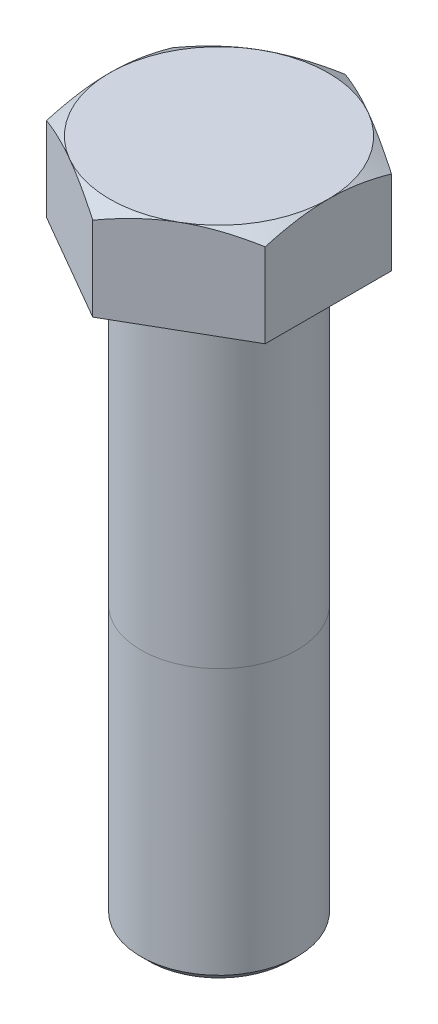
ISO-10303-21;
HEADER;
FILE_DESCRIPTION(('STEP AP214'),'2;1');
FILE_NAME('part.step','',(''),(''),'','','');
FILE_SCHEMA(('AUTOMOTIVE_DESIGN { 1 0 10303 214 1 1 1 1 }'));
ENDSEC;
DATA;
#1=APPLICATION_CONTEXT('core data for automotive mechanical design processes');
#2=APPLICATION_PROTOCOL_DEFINITION('international standard','automotive_design',2000,#1);
#3=PRODUCT_CONTEXT('',#1,'mechanical');
#4=PRODUCT('Part','Part','',(#3));
#5=PRODUCT_RELATED_PRODUCT_CATEGORY('part','',(#4));
#6=PRODUCT_DEFINITION_FORMATION('','',#4);
#7=PRODUCT_DEFINITION_CONTEXT('part definition',#1,'design');
#8=PRODUCT_DEFINITION('design','',#6,#7);
#9=PRODUCT_DEFINITION_SHAPE('','',#8);
#10=(LENGTH_UNIT() NAMED_UNIT(*) SI_UNIT(.MILLI.,.METRE.));
#11=(NAMED_UNIT(*) PLANE_ANGLE_UNIT() SI_UNIT($,.RADIAN.));
#12=(NAMED_UNIT(*) SI_UNIT($,.STERADIAN.) SOLID_ANGLE_UNIT());
#13=UNCERTAINTY_MEASURE_WITH_UNIT(LENGTH_MEASURE(1.E-05),#10,'distance_accuracy_value','');
#14=(GEOMETRIC_REPRESENTATION_CONTEXT(3) GLOBAL_UNCERTAINTY_ASSIGNED_CONTEXT((#13)) GLOBAL_UNIT_ASSIGNED_CONTEXT((#10,
#11,#12)) REPRESENTATION_CONTEXT('',''));
#15=CARTESIAN_POINT('',(0.,0.,0.));
#16=DIRECTION('',(0.,0.,1.));
#17=DIRECTION('',(1.,0.,0.));
#18=AXIS2_PLACEMENT_3D('',#15,#16,#17);
#19=CARTESIAN_POINT('',(0.,-75.,0.));
#20=DIRECTION('',(0.,1.,0.));
#21=DIRECTION('',(0.,0.,1.));
#22=AXIS2_PLACEMENT_3D('',#19,#20,#21);
#23=CYLINDRICAL_SURFACE('',#22,10.);
#24=CARTESIAN_POINT('',(0.,-74.,0.));
#25=DIRECTION('',(0.,-1.,0.));
#26=DIRECTION('',(0.,0.,-1.));
#27=AXIS2_PLACEMENT_3D('',#24,#25,#26);
#28=CIRCLE('',#27,10.);
#29=CARTESIAN_POINT('',(0.,-74.,-10.));
#30=VERTEX_POINT('',#29);
#31=EDGE_CURVE('E230',#30,#30,#28,.F.);
#32=ORIENTED_EDGE('',*,*,#31,.T.);
#33=EDGE_LOOP('',(#32));
#34=FACE_BOUND('',#33,.T.);
#35=CARTESIAN_POINT('',(0.,-40.,0.));
#36=DIRECTION('',(0.,1.,0.));
#37=DIRECTION('',(0.,0.,1.));
#38=AXIS2_PLACEMENT_3D('',#35,#36,#37);
#39=CIRCLE('',#38,10.);
#40=CARTESIAN_POINT('',(10.,-40.,0.));
#41=VERTEX_POINT('',#40);
#42=CARTESIAN_POINT('',(-10.,-40.,0.));
#43=VERTEX_POINT('',#42);
#44=EDGE_CURVE('E12',#41,#43,#39,.T.);
#45=ORIENTED_EDGE('',*,*,#44,.F.);
#46=EDGE_CURVE('E42',#43,#41,#39,.T.);
#47=ORIENTED_EDGE('',*,*,#46,.F.);
#48=EDGE_LOOP('',(#45,#47));
#49=FACE_BOUND('',#48,.T.);
#50=ADVANCED_FACE('F38',(#34,#49),#23,.T.);
#51=CARTESIAN_POINT('',(13.9999999999999,12.,-8.08290376865493));
#52=DIRECTION('',(-0.499999999999995,0.,0.866025403784442));
#53=DIRECTION('',(0.866025403784442,0.,0.499999999999995));
#54=AXIS2_PLACEMENT_3D('',#51,#52,#53);
#55=PLANE('',#54);
#56=CARTESIAN_POINT('',(14.0001999999999,10.7495037679405,-8.08278829860109));
#57=CARTESIAN_POINT('',(13.692485390418,10.8520687355186,-8.26044741127679));
#58=CARTESIAN_POINT('',(13.3835705284392,10.9499795109551,-8.43879948999693));
#59=CARTESIAN_POINT('',(12.7632636692859,11.1351989694353,-8.79693382210927));
#60=CARTESIAN_POINT('',(12.4518708930622,11.2225041654762,-8.97671652528573));
#61=CARTESIAN_POINT('',(11.8260063991706,11.3853389062415,-9.33805955931023));
#62=CARTESIAN_POINT('',(11.5115292047328,11.4608405894043,-9.51962305217292));
#63=CARTESIAN_POINT('',(10.8803895759988,11.5984470625897,-9.88401168671869));
#64=CARTESIAN_POINT('',(10.5637272674324,11.6605526168897,-10.0668367558117));
#65=CARTESIAN_POINT('',(9.93633151674908,11.7687252680104,-10.4290638613572));
#66=CARTESIAN_POINT('',(9.62564465325532,11.81515039644,-10.608439005629));
#67=CARTESIAN_POINT('',(9.00284729327502,11.8929951265452,-10.9680112290642));
#68=CARTESIAN_POINT('',(8.69073676950307,11.9244144393938,-11.1482083239808));
#69=CARTESIAN_POINT('',(8.06599141476652,11.9714542186344,-11.5089052227129));
#70=CARTESIAN_POINT('',(7.75335765114492,11.9870934589967,-11.6894044102976));
#71=CARTESIAN_POINT('',(7.12780152662085,12.0022367596144,-12.0505694071848));
#72=CARTESIAN_POINT('',(6.81487917493442,12.0017413184259,-12.2312352111664));
#73=CARTESIAN_POINT('',(6.22987230119092,11.9857422399056,-12.5689890872));
#74=CARTESIAN_POINT('',(5.95774609067854,11.9721901053228,-12.7261012280929));
#75=CARTESIAN_POINT('',(5.4141196223318,11.9331392398875,-13.0399641159315));
#76=CARTESIAN_POINT('',(5.14261941013842,11.9076396640127,-13.1967148365264));
#77=CARTESIAN_POINT('',(4.60039240839659,11.8451385190433,-13.5097697419439));
#78=CARTESIAN_POINT('',(4.32966644468914,11.8081274502385,-13.666073449967));
#79=CARTESIAN_POINT('',(3.78948373337586,11.7232526731859,-13.9779480837553));
#80=CARTESIAN_POINT('',(3.52002707332622,11.6753882271492,-14.1335189589699));
#81=CARTESIAN_POINT('',(2.7020763881878,11.5143048722361,-14.6057630072184));
#82=CARTESIAN_POINT('',(2.15595101855749,11.3850242516312,-14.9210686363857));
#83=CARTESIAN_POINT('',(1.07184369066129,11.0916100987947,-15.546978293977));
#84=CARTESIAN_POINT('',(0.533847852112651,10.9275454762134,-15.857590336186));
#85=CARTESIAN_POINT('',(-0.00019999999999807,10.7495037679405,-16.1659230073634));
#86=B_SPLINE_CURVE_WITH_KNOTS('',3,(#56,#57,#58,#59,#60,#61,#62,#63,#64,#65,#66,#67,#68,#69,#70,
#71,#72,#73,#74,#75,#76,#77,#78,#79,#80,#81,#82,#83,#84,#85),.UNSPECIFIED.,.F.,.F.,(4,2,2,2,2,2,
2,2,2,2,2,2,2,2,4),(0.,1.10950436744395,2.21937254652007,3.33182219257025,4.44420835421649,
5.52913815688045,6.6140888410734,7.69774720328185,8.78137208085321,9.7246938335815,
10.6680823159393,11.6122513923123,12.5564846704802,14.486474683919,16.4126763879159),.UNSPECIFIED.);
#87=CARTESIAN_POINT('',(13.9999999999999,10.7495704353215,-8.08290376865493));
#88=VERTEX_POINT('',#87);
#89=CARTESIAN_POINT('',(6.99999999999998,12.,-12.1243556529823));
#90=VERTEX_POINT('',#89);
#91=EDGE_CURVE('E111',#88,#90,#86,.T.);
#92=ORIENTED_EDGE('',*,*,#91,.F.);
#93=DIRECTION('',(0.,-1.,0.));
#94=VECTOR('',#93,1.);
#95=CARTESIAN_POINT('',(13.9999999999999,12.,-8.08290376865493));
#96=LINE('',#95,#94);
#97=CARTESIAN_POINT('',(13.9999999999999,0.,-8.08290376865493));
#98=VERTEX_POINT('',#97);
#99=EDGE_CURVE('E399',#88,#98,#96,.T.);
#100=ORIENTED_EDGE('',*,*,#99,.T.);
#101=DIRECTION('',(-0.866025403784441,0.,-0.499999999999995));
#102=VECTOR('',#101,1.);
#103=CARTESIAN_POINT('',(13.9999999999999,0.,-8.08290376865493));
#104=LINE('',#103,#102);
#105=CARTESIAN_POINT('',(0.,0.,-16.1658075373095));
#106=VERTEX_POINT('',#105);
#107=EDGE_CURVE('E122',#98,#106,#104,.T.);
#108=ORIENTED_EDGE('',*,*,#107,.T.);
#109=DIRECTION('',(0.,-1.,0.));
#110=VECTOR('',#109,1.);
#111=CARTESIAN_POINT('',(0.,12.,-16.1658075373095));
#112=LINE('',#111,#110);
#113=CARTESIAN_POINT('',(0.,10.7495704353215,-16.1658075373095));
#114=VERTEX_POINT('',#113);
#115=EDGE_CURVE('E145',#114,#106,#112,.T.);
#116=ORIENTED_EDGE('',*,*,#115,.F.);
#117=EDGE_CURVE('E123',#90,#114,#86,.T.);
#118=ORIENTED_EDGE('',*,*,#117,.F.);
#119=EDGE_LOOP('',(#92,#100,#108,#116,#118));
#120=FACE_BOUND('',#119,.T.);
#121=ADVANCED_FACE('F143',(#120),#55,.F.);
#122=CARTESIAN_POINT('',(0.,12.,-16.1658075373095));
#123=DIRECTION('',(0.500000000000001,0.,0.866025403784438));
#124=DIRECTION('',(0.866025403784438,0.,-0.500000000000001));
#125=AXIS2_PLACEMENT_3D('',#122,#123,#124);
#126=PLANE('',#125);
#127=CARTESIAN_POINT('',(0.0002,10.7495037679405,-16.1659230073634));
#128=CARTESIAN_POINT('',(-0.30751460958192,10.8520687355186,-15.9882638946877));
#129=CARTESIAN_POINT('',(-0.616429471560718,10.9499795109551,-15.8099118159675));
#130=CARTESIAN_POINT('',(-1.23673633071406,11.1351989694353,-15.4517774838552));
#131=CARTESIAN_POINT('',(-1.54812910693776,11.2225041654762,-15.2719947806787));
#132=CARTESIAN_POINT('',(-2.17399360082929,11.3853389062415,-14.9106517466542));
#133=CARTESIAN_POINT('',(-2.48847079526713,11.4608405894044,-14.7290882537915));
#134=CARTESIAN_POINT('',(-3.11961042400106,11.5984470625897,-14.3646996192457));
#135=CARTESIAN_POINT('',(-3.43627273256745,11.6605526168898,-14.1818745501527));
#136=CARTESIAN_POINT('',(-4.06366848325081,11.7687252680104,-13.8196474446073));
#137=CARTESIAN_POINT('',(-4.37435534674457,11.81515039644,-13.6402723003355));
#138=CARTESIAN_POINT('',(-4.99715270672487,11.8929951265452,-13.2807000769003));
#139=CARTESIAN_POINT('',(-5.30926323049682,11.9244144393939,-13.1005029819836));
#140=CARTESIAN_POINT('',(-5.93400858523337,11.9714542186344,-12.7398060832515));
#141=CARTESIAN_POINT('',(-6.24664234885496,11.9870934589967,-12.5593068956668));
#142=CARTESIAN_POINT('',(-6.87219847337904,12.0022367596144,-12.1981418987796));
#143=CARTESIAN_POINT('',(-7.18512082506547,12.0017413184259,-12.017476094798));
#144=CARTESIAN_POINT('',(-7.77012769880897,11.9857422399057,-11.6797222187644));
#145=CARTESIAN_POINT('',(-8.04225390932135,11.9721901053228,-11.5226100778715));
#146=CARTESIAN_POINT('',(-8.58588037766811,11.9331392398875,-11.2087471900329));
#147=CARTESIAN_POINT('',(-8.85738058986149,11.9076396640127,-11.051996469438));
#148=CARTESIAN_POINT('',(-9.39960759160333,11.8451385190433,-10.7389415640205));
#149=CARTESIAN_POINT('',(-9.6703335553108,11.8081274502386,-10.5826378559974));
#150=CARTESIAN_POINT('',(-10.2105162666241,11.7232526731859,-10.270763222209));
#151=CARTESIAN_POINT('',(-10.4799729266737,11.6753882271493,-10.1151923469944));
#152=CARTESIAN_POINT('',(-11.2979236118122,11.5143048722361,-9.64294829874593));
#153=CARTESIAN_POINT('',(-11.8440489814425,11.3850242516312,-9.32764266957858));
#154=CARTESIAN_POINT('',(-12.9281563093387,11.0916100987947,-8.70173301198725));
#155=CARTESIAN_POINT('',(-13.4661521478874,10.9275454762134,-8.39112096977828));
#156=CARTESIAN_POINT('',(-14.0002,10.7495037679405,-8.0827882986009));
#157=B_SPLINE_CURVE_WITH_KNOTS('',3,(#127,#128,#129,#130,#131,#132,#133,#134,#135,#136,#137,
#138,#139,#140,#141,#142,#143,#144,#145,#146,#147,#148,#149,#150,#151,#152,#153,#154,#155,#156),
.UNSPECIFIED.,.F.,.F.,(4,2,2,2,2,2,2,2,2,2,2,2,2,2,4),(0.,1.10950436744395,2.21937254652007,
3.33182219257025,4.44420835421649,5.52913815688045,6.6140888410734,7.69774720328185,
8.78137208085321,9.72469383358152,10.6680823159394,11.6122513923124,12.5564846704803,
14.4864746839191,16.4126763879161),.UNSPECIFIED.);
#158=CARTESIAN_POINT('',(-7.00000000000006,12.,-12.1243556529822));
#159=VERTEX_POINT('',#158);
#160=EDGE_CURVE('E130',#114,#159,#157,.T.);
#161=ORIENTED_EDGE('',*,*,#160,.F.);
#162=ORIENTED_EDGE('',*,*,#115,.T.);
#163=DIRECTION('',(-0.866025403784438,0.,0.500000000000001));
#164=VECTOR('',#163,1.);
#165=CARTESIAN_POINT('',(0.,0.,-16.1658075373095));
#166=LINE('',#165,#164);
#167=CARTESIAN_POINT('',(-14.,0.,-8.08290376865473));
#168=VERTEX_POINT('',#167);
#169=EDGE_CURVE('E385',#106,#168,#166,.T.);
#170=ORIENTED_EDGE('',*,*,#169,.T.);
#171=DIRECTION('',(0.,-1.,0.));
#172=VECTOR('',#171,1.);
#173=CARTESIAN_POINT('',(-14.,12.,-8.08290376865473));
#174=LINE('',#173,#172);
#175=CARTESIAN_POINT('',(-14.,10.7495704353215,-8.08290376865473));
#176=VERTEX_POINT('',#175);
#177=EDGE_CURVE('E372',#176,#168,#174,.T.);
#178=ORIENTED_EDGE('',*,*,#177,.F.);
#179=EDGE_CURVE('E146',#159,#176,#157,.T.);
#180=ORIENTED_EDGE('',*,*,#179,.F.);
#181=EDGE_LOOP('',(#161,#162,#170,#178,#180));
#182=FACE_BOUND('',#181,.T.);
#183=ADVANCED_FACE('F202',(#182),#126,.F.);
#184=CARTESIAN_POINT('',(-14.,12.,-8.08290376865473));
#185=DIRECTION('',(1.,0.,0.));
#186=DIRECTION('',(0.,0.,-1.));
#187=AXIS2_PLACEMENT_3D('',#184,#185,#186);
#188=PLANE('',#187);
#189=CARTESIAN_POINT('',(-14.0000000000001,4.9929262662574,-22.0708464511124));
#190=CARTESIAN_POINT('',(-14.0000000000001,5.14275124303849,-21.7635317294493));
#191=CARTESIAN_POINT('',(-14.0000000000001,5.29185572993375,-21.4558659102519));
#192=CARTESIAN_POINT('',(-14.0000000000001,5.5884612019827,-20.8397589225449));
#193=CARTESIAN_POINT('',(-14.0000000000001,5.73596217205728,-20.5313177467776));
#194=CARTESIAN_POINT('',(-14.0000000000001,6.17585266530552,-19.6046440658177));
#195=CARTESIAN_POINT('',(-14.0000000000001,6.46558793480524,-18.985146993954));
#196=CARTESIAN_POINT('',(-14.0000000000001,7.03777842659728,-17.7389229419706));
#197=CARTESIAN_POINT('',(-14.0000000000001,7.32018843734661,-17.1121751555634));
#198=CARTESIAN_POINT('',(-14.0000000000001,7.87392351157105,-15.8538185605421));
#199=CARTESIAN_POINT('',(-14.0000000000001,8.14524907613409,-15.2222099732047));
#200=CARTESIAN_POINT('',(-14.,8.68287642103216,-13.9315623948036));
#201=CARTESIAN_POINT('',(-14.,8.94869404545956,-13.2723207079044));
#202=CARTESIAN_POINT('',(-14.,9.46106815771068,-11.9462543067215));
#203=CARTESIAN_POINT('',(-14.,9.7076225355383,-11.2794287708808));
#204=CARTESIAN_POINT('',(-14.,10.1752562812004,-9.93829007996892));
#205=CARTESIAN_POINT('',(-14.,10.3963842259172,-9.26399399477936));
#206=CARTESIAN_POINT('',(-14.,10.8063230706907,-7.90567438957491));
#207=CARTESIAN_POINT('',(-14.,10.9951437744373,-7.22165388893535));
#208=CARTESIAN_POINT('',(-14.,11.2469826271115,-6.19005259406049));
#209=CARTESIAN_POINT('',(-14.,11.3255182686885,-5.84623937715446));
#210=CARTESIAN_POINT('',(-14.,11.4712203231524,-5.15619981137413));
#211=CARTESIAN_POINT('',(-14.,11.5383869516838,-4.80997350840035));
#212=CARTESIAN_POINT('',(-14.,11.6601886055271,-4.11532107439354));
#213=CARTESIAN_POINT('',(-14.,11.7148239343751,-3.76689499685405));
#214=CARTESIAN_POINT('',(-14.,11.8104879106357,-3.06818295873867));
#215=CARTESIAN_POINT('',(-14.,11.8515171747976,-2.71789708319704));
#216=CARTESIAN_POINT('',(-14.,11.9186189969932,-2.02068299448591));
#217=CARTESIAN_POINT('',(-14.,11.9448869154068,-1.67377370041464));
#218=CARTESIAN_POINT('',(-14.,11.982714353247,-0.979154581819277));
#219=CARTESIAN_POINT('',(-14.,11.9942741272177,-0.631444771253525));
#220=CARTESIAN_POINT('',(-14.,12.0024083352311,0.0641555508148906));
#221=CARTESIAN_POINT('',(-14.,11.9989826830173,0.412046063346156));
#222=CARTESIAN_POINT('',(-14.,11.9772334591863,1.10736455511384));
#223=CARTESIAN_POINT('',(-14.,11.9589092277901,1.45479251318367));
#224=CARTESIAN_POINT('',(-14.,11.8981630213456,2.27898981776441));
#225=CARTESIAN_POINT('',(-14.,11.8492724589863,2.75529345557613));
#226=CARTESIAN_POINT('',(-14.,11.7260767882862,3.7045764267197));
#227=CARTESIAN_POINT('',(-14.,11.6517685292217,4.17755534050446));
#228=CARTESIAN_POINT('',(-14.,11.3946404724375,5.59083240609913));
#229=CARTESIAN_POINT('',(-14.,11.1776561360504,6.52500890789112));
#230=CARTESIAN_POINT('',(-14.,10.7986268168437,7.92263893119763));
#231=CARTESIAN_POINT('',(-14.,10.6614717908851,8.39326124342679));
#232=CARTESIAN_POINT('',(-14.,10.3722342289336,9.32994178055295));
#233=CARTESIAN_POINT('',(-14.,10.2201515769835,9.79599996996509));
#234=CARTESIAN_POINT('',(-14.,9.90355317140104,10.7236894183547));
#235=CARTESIAN_POINT('',(-14.,9.73904087323602,11.1853218677748));
#236=CARTESIAN_POINT('',(-14.,9.39959440787297,12.1047171896401));
#237=CARTESIAN_POINT('',(-14.,9.22466048529941,12.5624801526251));
#238=CARTESIAN_POINT('',(-14.,8.8915593981375,13.4097205970991));
#239=CARTESIAN_POINT('',(-14.,8.73454467816074,13.7996531108267));
#240=CARTESIAN_POINT('',(-14.,8.41497627866843,14.5772449554084));
#241=CARTESIAN_POINT('',(-14.,8.25242250883824,14.9649042490767));
#242=CARTESIAN_POINT('',(-13.9999999999999,7.75759096216505,16.1248984904875));
#243=CARTESIAN_POINT('',(-13.9999999999999,7.41816793521498,16.8941869802671));
#244=CARTESIAN_POINT('',(-13.9999999999999,6.72486730312806,18.4265439578638));
#245=CARTESIAN_POINT('',(-13.9999999999999,6.3709840587165,19.189609877089));
#246=CARTESIAN_POINT('',(-13.9999999999999,5.6522207314638,20.7104937337654));
#247=CARTESIAN_POINT('',(-13.9999999999999,5.28734110953805,21.4683118895448));
#248=CARTESIAN_POINT('',(-13.9999999999999,4.5483951086418,22.9809814527115));
#249=CARTESIAN_POINT('',(-13.9999999999999,4.17431467535074,23.7358259772575));
#250=CARTESIAN_POINT('',(-13.9999999999999,3.41933163303294,25.2420982475247));
#251=CARTESIAN_POINT('',(-13.9999999999999,3.03842896550592,25.9935259638776));
#252=CARTESIAN_POINT('',(-13.9999999999999,2.27123453755848,27.4934101126827));
#253=CARTESIAN_POINT('',(-13.9999999999999,1.88494399929607,28.2418671710501));
#254=CARTESIAN_POINT('',(-13.9999999999999,1.1079062428235,29.7364586258524));
#255=CARTESIAN_POINT('',(-13.9999999999999,0.717159039409872,30.4825930299882));
#256=CARTESIAN_POINT('',(-13.9999999999999,-0.376681717839417,32.5588957188085));
#257=CARTESIAN_POINT('',(-13.9999999999999,-1.08377518094656,33.8869563154793));
#258=CARTESIAN_POINT('',(-13.9999999999999,-2.50642278067769,36.5386359899748));
#259=CARTESIAN_POINT('',(-13.9999999999999,-3.22197745063328,37.8622547809972));
#260=CARTESIAN_POINT('',(-13.9999999999999,-4.65694237423431,40.5015601121558));
#261=CARTESIAN_POINT('',(-13.9999999999999,-5.37633119225281,41.8172583141464));
#262=CARTESIAN_POINT('',(-13.9999999999999,-6.45898623976699,43.7887734293993));
#263=CARTESIAN_POINT('',(-13.9999999999998,-6.82045209744779,44.4455803285327));
#264=CARTESIAN_POINT('',(-13.9999999999998,-7.54445049309536,45.7586049465646));
#265=CARTESIAN_POINT('',(-13.9999999999998,-7.90698302973819,46.414822666193));
#266=CARTESIAN_POINT('',(-13.9999999999998,-8.26998269816177,47.0707819459226));
#267=B_SPLINE_CURVE_WITH_KNOTS('',3,(#189,#190,#191,#192,#193,#194,#195,#196,#197,#198,#199,
#200,#201,#202,#203,#204,#205,#206,#207,#208,#209,#210,#211,#212,#213,#214,#215,#216,#217,#218,
#219,#220,#221,#222,#223,#224,#225,#226,#227,#228,#229,#230,#231,#232,#233,#234,#235,#236,#237,
#238,#239,#240,#241,#242,#243,#244,#245,#246,#247,#248,#249,#250,#251,#252,#253,#254,#255,#256,
#257,#258,#259,#260,#261,#262,#263,#264,#265,#266),.UNSPECIFIED.,.F.,.F.,(4,2,2,2,2,2,2,2,2,2,2,
2,2,2,2,2,2,2,2,2,2,2,2,2,2,2,2,2,2,2,2,2,2,2,2,2,2,2,4),(0.,1.02567303510318,2.05135570707411,
4.1030068312029,6.16523091308031,8.22736166583617,10.3595780570469,12.4920276737007,
14.6203330934023,16.7479915251801,17.8058407964076,18.8636700003801,19.921473578669,
20.9792292012291,22.0226346553687,23.0660220517475,24.109415453909,25.1528550649388,
26.5884704769934,28.0242639094029,30.8972352596949,32.3677049821978,33.8381861281622,
35.3082599709319,36.7782993205724,38.0393273005601,39.3003758515586,41.8226757074495,
44.3459687915101,46.8691562579273,49.3964720962215,51.9238096164936,54.4505828820193,
56.9773477608708,61.4910053297432,66.0049489389382,70.5035167757154,72.7526216209398,
75.0017236758172),.UNSPECIFIED.);
#268=CARTESIAN_POINT('',(-14.0000000000001,12.,0.));
#269=VERTEX_POINT('',#268);
#270=EDGE_CURVE('E196',#176,#269,#267,.T.);
#271=ORIENTED_EDGE('',*,*,#270,.F.);
#272=ORIENTED_EDGE('',*,*,#177,.T.);
#273=DIRECTION('',(0.,0.,1.));
#274=VECTOR('',#273,1.);
#275=CARTESIAN_POINT('',(-14.,0.,-8.08290376865473));
#276=LINE('',#275,#274);
#277=CARTESIAN_POINT('',(-14.,0.,8.08290376865483));
#278=VERTEX_POINT('',#277);
#279=EDGE_CURVE('E370',#168,#278,#276,.T.);
#280=ORIENTED_EDGE('',*,*,#279,.T.);
#281=DIRECTION('',(0.,-1.,0.));
#282=VECTOR('',#281,1.);
#283=CARTESIAN_POINT('',(-14.,12.,8.08290376865483));
#284=LINE('',#283,#282);
#285=CARTESIAN_POINT('',(-14.,10.7495704353215,8.08290376865483));
#286=VERTEX_POINT('',#285);
#287=EDGE_CURVE('E362',#286,#278,#284,.T.);
#288=ORIENTED_EDGE('',*,*,#287,.F.);
#289=EDGE_CURVE('E191',#269,#286,#267,.T.);
#290=ORIENTED_EDGE('',*,*,#289,.F.);
#291=EDGE_LOOP('',(#271,#272,#280,#288,#290));
#292=FACE_BOUND('',#291,.T.);
#293=ADVANCED_FACE('F198',(#292),#188,.F.);
#294=CARTESIAN_POINT('',(-14.,12.,8.08290376865483));
#295=DIRECTION('',(0.499999999999995,0.,-0.866025403784442));
#296=DIRECTION('',(-0.866025403784442,0.,-0.499999999999995));
#297=AXIS2_PLACEMENT_3D('',#294,#295,#296);
#298=PLANE('',#297);
#299=CARTESIAN_POINT('',(-14.0002,10.7495037679405,8.08278829860099));
#300=CARTESIAN_POINT('',(-13.6924853904181,10.8520687355186,8.2604474112767));
#301=CARTESIAN_POINT('',(-13.3835705284393,10.9499795109551,8.43879948999683));
#302=CARTESIAN_POINT('',(-12.7632636692859,11.1351989694353,8.79693382210918));
#303=CARTESIAN_POINT('',(-12.4518708930622,11.2225041654762,8.97671652528563));
#304=CARTESIAN_POINT('',(-11.8260063991707,11.3853389062415,9.33805955931014));
#305=CARTESIAN_POINT('',(-11.5115292047328,11.4608405894044,9.51962305217282));
#306=CARTESIAN_POINT('',(-10.8803895759989,11.5984470625897,9.88401168671859));
#307=CARTESIAN_POINT('',(-10.5637272674325,11.6605526168898,10.0668367558116));
#308=CARTESIAN_POINT('',(-9.93633151674915,11.7687252680104,10.4290638613571));
#309=CARTESIAN_POINT('',(-9.62564465325538,11.81515039644,10.6084390056289));
#310=CARTESIAN_POINT('',(-9.00284729327509,11.8929951265452,10.9680112290641));
#311=CARTESIAN_POINT('',(-8.69073676950313,11.9244144393939,11.1482083239807));
#312=CARTESIAN_POINT('',(-8.06599141476658,11.9714542186344,11.5089052227128));
#313=CARTESIAN_POINT('',(-7.75335765114499,11.9870934589967,11.6894044102975));
#314=CARTESIAN_POINT('',(-7.12780152662091,12.0022367596144,12.0505694071847));
#315=CARTESIAN_POINT('',(-6.81487917493448,12.0017413184259,12.2312352111663));
#316=CARTESIAN_POINT('',(-6.22987230119097,11.9857422399057,12.5689890871999));
#317=CARTESIAN_POINT('',(-5.95774609067858,11.9721901053228,12.7261012280928));
#318=CARTESIAN_POINT('',(-5.41411962233183,11.9331392398875,13.0399641159314));
#319=CARTESIAN_POINT('',(-5.14261941013845,11.9076396640127,13.1967148365263));
#320=CARTESIAN_POINT('',(-4.6003924083966,11.8451385190433,13.5097697419438));
#321=CARTESIAN_POINT('',(-4.32966644468914,11.8081274502386,13.6660734499669));
#322=CARTESIAN_POINT('',(-3.78948373337585,11.7232526731859,13.9779480837552));
#323=CARTESIAN_POINT('',(-3.5200270733262,11.6753882271493,14.1335189589698));
#324=CARTESIAN_POINT('',(-2.70207638818776,11.5143048722361,14.6057630072184));
#325=CARTESIAN_POINT('',(-2.15595101855743,11.3850242516312,14.9210686363857));
#326=CARTESIAN_POINT('',(-1.07184369066121,11.0916100987947,15.546978293977));
#327=CARTESIAN_POINT('',(-0.53384785211255,10.9275454762134,15.857590336186));
#328=CARTESIAN_POINT('',(0.000200000000112109,10.7495037679405,16.1659230073634));
#329=B_SPLINE_CURVE_WITH_KNOTS('',3,(#299,#300,#301,#302,#303,#304,#305,#306,#307,#308,#309,
#310,#311,#312,#313,#314,#315,#316,#317,#318,#319,#320,#321,#322,#323,#324,#325,#326,#327,#328),
.UNSPECIFIED.,.F.,.F.,(4,2,2,2,2,2,2,2,2,2,2,2,2,2,4),(0.,1.10950436744395,2.21937254652007,
3.33182219257025,4.44420835421649,5.52913815688045,6.6140888410734,7.69774720328185,
8.78137208085321,9.72469383358152,10.6680823159394,11.6122513923124,12.5564846704803,
14.4864746839191,16.4126763879161),.UNSPECIFIED.);
#330=CARTESIAN_POINT('',(-6.99999999999998,12.,12.1243556529823));
#331=VERTEX_POINT('',#330);
#332=EDGE_CURVE('E197',#286,#331,#329,.T.);
#333=ORIENTED_EDGE('',*,*,#332,.F.);
#334=ORIENTED_EDGE('',*,*,#287,.T.);
#335=DIRECTION('',(0.866025403784441,0.,0.499999999999995));
#336=VECTOR('',#335,1.);
#337=CARTESIAN_POINT('',(-14.,0.,8.08290376865483));
#338=LINE('',#337,#336);
#339=CARTESIAN_POINT('',(1.12885230687692E-13,0.,16.1658075373095));
#340=VERTEX_POINT('',#339);
#341=EDGE_CURVE('E389',#278,#340,#338,.T.);
#342=ORIENTED_EDGE('',*,*,#341,.T.);
#343=DIRECTION('',(0.,-1.,0.));
#344=VECTOR('',#343,1.);
#345=CARTESIAN_POINT('',(1.12885230687692E-13,12.,16.1658075373095));
#346=LINE('',#345,#344);
#347=CARTESIAN_POINT('',(1.13075960458543E-13,10.7495704353215,16.1658075373095));
#348=VERTEX_POINT('',#347);
#349=EDGE_CURVE('E373',#348,#340,#346,.T.);
#350=ORIENTED_EDGE('',*,*,#349,.F.);
#351=EDGE_CURVE('E186',#331,#348,#329,.T.);
#352=ORIENTED_EDGE('',*,*,#351,.F.);
#353=EDGE_LOOP('',(#333,#334,#342,#350,#352));
#354=FACE_BOUND('',#353,.T.);
#355=ADVANCED_FACE('F201',(#354),#298,.F.);
#356=CARTESIAN_POINT('',(1.12885230687692E-13,12.,16.1658075373095));
#357=DIRECTION('',(-0.500000000000007,0.,-0.866025403784435));
#358=DIRECTION('',(-0.866025403784434,0.,0.500000000000007));
#359=AXIS2_PLACEMENT_3D('',#356,#357,#358);
#360=PLANE('',#359);
#361=CARTESIAN_POINT('',(-0.000199999999887115,10.7495037679405,16.1659230073634));
#362=CARTESIAN_POINT('',(0.307514609582032,10.8520687355186,15.9882638946877));
#363=CARTESIAN_POINT('',(0.616429471560829,10.9499795109551,15.8099118159675));
#364=CARTESIAN_POINT('',(1.23673633071417,11.1351989694353,15.4517774838552));
#365=CARTESIAN_POINT('',(1.54812910693786,11.2225041654762,15.2719947806787));
#366=CARTESIAN_POINT('',(2.1739936008294,11.3853389062415,14.9106517466542));
#367=CARTESIAN_POINT('',(2.48847079526723,11.4608405894044,14.7290882537915));
#368=CARTESIAN_POINT('',(3.11961042400116,11.5984470625897,14.3646996192457));
#369=CARTESIAN_POINT('',(3.43627273256755,11.6605526168898,14.1818745501527));
#370=CARTESIAN_POINT('',(4.06366848325091,11.7687252680104,13.8196474446072));
#371=CARTESIAN_POINT('',(4.37435534674467,11.81515039644,13.6402723003354));
#372=CARTESIAN_POINT('',(4.99715270672496,11.8929951265452,13.2807000769002));
#373=CARTESIAN_POINT('',(5.30926323049691,11.9244144393939,13.1005029819836));
#374=CARTESIAN_POINT('',(5.93400858523345,11.9714542186344,12.7398060832514));
#375=CARTESIAN_POINT('',(6.24664234885505,11.9870934589967,12.5593068956667));
#376=CARTESIAN_POINT('',(6.87219847337912,12.0022367596144,12.1981418987796));
#377=CARTESIAN_POINT('',(7.18512082506555,12.0017413184259,12.0174760947979));
#378=CARTESIAN_POINT('',(7.77012769880905,11.9857422399057,11.6797222187643));
#379=CARTESIAN_POINT('',(8.04225390932144,11.9721901053228,11.5226100778715));
#380=CARTESIAN_POINT('',(8.58588037766819,11.9331392398875,11.2087471900329));
#381=CARTESIAN_POINT('',(8.85738058986157,11.9076396640127,11.051996469438));
#382=CARTESIAN_POINT('',(9.39960759160341,11.8451385190433,10.7389415640204));
#383=CARTESIAN_POINT('',(9.67033355531087,11.8081274502386,10.5826378559973));
#384=CARTESIAN_POINT('',(10.2105162666242,11.7232526731859,10.270763222209));
#385=CARTESIAN_POINT('',(10.4799729266738,11.6753882271493,10.1151923469944));
#386=CARTESIAN_POINT('',(11.2979236118122,11.5143048722361,9.64294829874585));
#387=CARTESIAN_POINT('',(11.8440489814426,11.3850242516312,9.32764266957849));
#388=CARTESIAN_POINT('',(12.9281563093388,11.0916100987947,8.70173301198716));
#389=CARTESIAN_POINT('',(13.4661521478874,10.9275454762134,8.39112096977819));
#390=CARTESIAN_POINT('',(14.0002000000001,10.7495037679405,8.0827882986008));
#391=B_SPLINE_CURVE_WITH_KNOTS('',3,(#361,#362,#363,#364,#365,#366,#367,#368,#369,#370,#371,
#372,#373,#374,#375,#376,#377,#378,#379,#380,#381,#382,#383,#384,#385,#386,#387,#388,#389,#390),
.UNSPECIFIED.,.F.,.F.,(4,2,2,2,2,2,2,2,2,2,2,2,2,2,4),(0.,1.10950436744395,2.21937254652007,
3.33182219257025,4.44420835421649,5.52913815688045,6.6140888410734,7.69774720328185,
8.78137208085321,9.72469383358152,10.6680823159394,11.6122513923124,12.5564846704803,
14.4864746839191,16.4126763879161),.UNSPECIFIED.);
#392=CARTESIAN_POINT('',(7.00000000000015,12.,12.1243556529822));
#393=VERTEX_POINT('',#392);
#394=EDGE_CURVE('E405',#348,#393,#391,.T.);
#395=ORIENTED_EDGE('',*,*,#394,.F.);
#396=ORIENTED_EDGE('',*,*,#349,.T.);
#397=DIRECTION('',(0.866025403784435,0.,-0.500000000000007));
#398=VECTOR('',#397,1.);
#399=CARTESIAN_POINT('',(1.12885230687692E-13,0.,16.1658075373095));
#400=LINE('',#399,#398);
#401=CARTESIAN_POINT('',(14.0000000000001,0.,8.08290376865464));
#402=VERTEX_POINT('',#401);
#403=EDGE_CURVE('E391',#340,#402,#400,.T.);
#404=ORIENTED_EDGE('',*,*,#403,.T.);
#405=DIRECTION('',(0.,-1.,0.));
#406=VECTOR('',#405,1.);
#407=CARTESIAN_POINT('',(14.0000000000001,12.,8.08290376865464));
#408=LINE('',#407,#406);
#409=CARTESIAN_POINT('',(14.0000000000001,10.7495704353215,8.08290376865464));
#410=VERTEX_POINT('',#409);
#411=EDGE_CURVE('E376',#410,#402,#408,.T.);
#412=ORIENTED_EDGE('',*,*,#411,.F.);
#413=EDGE_CURVE('E180',#393,#410,#391,.T.);
#414=ORIENTED_EDGE('',*,*,#413,.F.);
#415=EDGE_LOOP('',(#395,#396,#404,#412,#414));
#416=FACE_BOUND('',#415,.T.);
#417=ADVANCED_FACE('F323',(#416),#360,.F.);
#418=CARTESIAN_POINT('',(14.0000000000001,12.,8.08290376865464));
#419=DIRECTION('',(-1.,0.,0.));
#420=DIRECTION('',(0.,0.,1.));
#421=AXIS2_PLACEMENT_3D('',#418,#419,#420);
#422=PLANE('',#421);
#423=CARTESIAN_POINT('',(13.9999999999998,4.99292627411987,-22.0708464349858));
#424=CARTESIAN_POINT('',(13.9999999999998,5.14275125073718,-21.7635317135941));
#425=CARTESIAN_POINT('',(13.9999999999998,5.29185573746874,-21.4558658946684));
#426=CARTESIAN_POINT('',(13.9999999999998,5.58846120919056,-20.839758907505));
#427=CARTESIAN_POINT('',(13.9999999999998,5.73596217910172,-20.5313177320096));
#428=CARTESIAN_POINT('',(13.9999999999998,6.17585267186021,-19.6046440518661));
#429=CARTESIAN_POINT('',(13.9999999999998,6.46558794103421,-18.9851469805475));
#430=CARTESIAN_POINT('',(13.9999999999998,7.03777843217465,-17.7389229296625));
#431=CARTESIAN_POINT('',(13.9999999999998,7.32018844259818,-17.1121751438086));
#432=CARTESIAN_POINT('',(13.9999999999998,7.87392351617637,-15.8538185498976));
#433=CARTESIAN_POINT('',(13.9999999999998,8.14524908041894,-15.2222099631171));
#434=CARTESIAN_POINT('',(13.9999999999999,8.68287642466608,-13.9315623858744));
#435=CARTESIAN_POINT('',(13.9999999999999,8.94869404876379,-13.2723206995771));
#436=CARTESIAN_POINT('',(13.9999999999999,9.4610681603729,-11.9462542996074));
#437=CARTESIAN_POINT('',(13.9999999999999,9.70762253788822,-11.2794287643782));
#438=CARTESIAN_POINT('',(13.9999999999999,10.1752562829553,-9.93829007470032));
#439=CARTESIAN_POINT('',(13.9999999999999,10.3963842273891,-9.26399399013336));
#440=CARTESIAN_POINT('',(13.9999999999999,10.8063230716423,-7.90567438619115));
#441=CARTESIAN_POINT('',(13.9999999999999,10.9951437751516,-7.22165388619123));
#442=CARTESIAN_POINT('',(13.9999999999999,11.2469826274845,-6.19005259244265));
#443=CARTESIAN_POINT('',(13.9999999999999,11.3255182689362,-5.84623937601698));
#444=CARTESIAN_POINT('',(13.9999999999999,11.4712203231808,-5.15619981120431));
#445=CARTESIAN_POINT('',(14.,11.5383869516182,-4.80997350871781));
#446=CARTESIAN_POINT('',(14.,11.6601886053097,-4.11532107569106));
#447=CARTESIAN_POINT('',(14.,11.7148239340998,-3.76689499864433));
#448=CARTESIAN_POINT('',(14.,11.8104879102853,-3.06818296151882));
#449=CARTESIAN_POINT('',(14.,11.8515171744298,-2.71789708647431));
#450=CARTESIAN_POINT('',(14.,11.9186189966348,-2.02068299874703));
#451=CARTESIAN_POINT('',(14.,11.9448869150743,-1.67377370516246));
#452=CARTESIAN_POINT('',(14.,11.9827143530095,-0.979154587539724));
#453=CARTESIAN_POINT('',(14.,11.9942741270492,-0.631444777459896));
#454=CARTESIAN_POINT('',(14.,12.0024083352431,0.0641555436401371));
#455=CARTESIAN_POINT('',(14.,11.9989826831407,0.412046055688944));
#456=CARTESIAN_POINT('',(14.,11.977233459572,1.10736454649798));
#457=CARTESIAN_POINT('',(14.,11.9589092283267,1.45479250409162));
#458=CARTESIAN_POINT('',(14.,11.8981630222529,2.2789898079438));
#459=CARTESIAN_POINT('',(14.,11.8492724601066,2.75529344550518));
#460=CARTESIAN_POINT('',(14.,11.7260767898436,3.70457641615962));
#461=CARTESIAN_POINT('',(14.,11.6517685310033,4.17755532970558));
#462=CARTESIAN_POINT('',(14.0000000000001,11.3946404748963,5.59083239459712));
#463=CARTESIAN_POINT('',(14.0000000000001,11.1776561389665,6.52500889593923));
#464=CARTESIAN_POINT('',(14.0000000000001,10.7986268204341,7.92263891857291));
#465=CARTESIAN_POINT('',(14.0000000000001,10.6614717947018,8.39326123057286));
#466=CARTESIAN_POINT('',(14.0000000000001,10.3722342331958,9.32994176724327));
#467=CARTESIAN_POINT('',(14.0000000000001,10.2201515814649,9.79599995642886));
#468=CARTESIAN_POINT('',(14.0000000000001,9.90355317631276,10.7236894043672));
#469=CARTESIAN_POINT('',(14.0000000000001,9.73904087835887,11.1853218535625));
#470=CARTESIAN_POINT('',(14.0000000000001,9.39959441341055,12.1047171749781));
#471=CARTESIAN_POINT('',(14.0000000000001,9.22466049104059,12.5624801377383));
#472=CARTESIAN_POINT('',(14.0000000000001,8.89155940415488,13.4097205820372));
#473=CARTESIAN_POINT('',(14.0000000000001,8.73454468424763,13.799653095813));
#474=CARTESIAN_POINT('',(14.0000000000002,8.41497628488333,14.577244940488));
#475=CARTESIAN_POINT('',(14.0000000000002,8.25242251511161,14.9649042342012));
#476=CARTESIAN_POINT('',(14.0000000000002,7.7575909685999,16.1248984757424));
#477=CARTESIAN_POINT('',(14.0000000000002,7.41816794173896,16.8941869656029));
#478=CARTESIAN_POINT('',(14.0000000000002,6.72486730980371,18.4265439433529));
#479=CARTESIAN_POINT('',(14.0000000000002,6.37098406545466,19.1896098626503));
#480=CARTESIAN_POINT('',(14.0000000000002,5.6522207383082,20.7104937194633));
#481=CARTESIAN_POINT('',(14.0000000000002,5.28734111642619,21.4683118753071));
#482=CARTESIAN_POINT('',(14.0000000000002,4.5483951156018,22.9809814386009));
#483=CARTESIAN_POINT('',(14.0000000000002,4.17431468233879,23.7358259632095));
#484=CARTESIAN_POINT('',(14.0000000000003,3.41933164006682,25.2420982335971));
#485=CARTESIAN_POINT('',(14.0000000000003,3.03842897255758,25.9935259500079));
#486=CARTESIAN_POINT('',(14.0000000000003,2.27123454463833,27.4934100989245));
#487=CARTESIAN_POINT('',(14.0000000000003,1.88494400638633,28.2418671573456));
#488=CARTESIAN_POINT('',(14.0000000000003,1.1079062499287,29.7364586122522));
#489=CARTESIAN_POINT('',(14.0000000000003,0.717159046519614,30.4825930164388));
#490=CARTESIAN_POINT('',(14.0000000000003,-0.376681710678353,32.5588957053118));
#491=CARTESIAN_POINT('',(14.0000000000004,-1.08377517374293,33.8869563019827));
#492=CARTESIAN_POINT('',(14.0000000000004,-2.50642277339754,36.5386359764743));
#493=CARTESIAN_POINT('',(14.0000000000004,-3.22197744331921,37.8622547674928));
#494=CARTESIAN_POINT('',(14.0000000000004,-4.65694236685031,40.5015600986258));
#495=CARTESIAN_POINT('',(14.0000000000004,-5.37633118483273,41.8172583005948));
#496=CARTESIAN_POINT('',(14.0000000000005,-6.45898623229567,43.7887734158135));
#497=CARTESIAN_POINT('',(14.0000000000005,-6.82045208995982,44.4455803149351));
#498=CARTESIAN_POINT('',(14.0000000000005,-7.54445048557495,45.7586049329429));
#499=CARTESIAN_POINT('',(14.0000000000005,-7.90698302220199,46.4148226525592));
#500=CARTESIAN_POINT('',(14.0000000000005,-8.26998269061013,47.0707819322764));
#501=B_SPLINE_CURVE_WITH_KNOTS('',3,(#423,#424,#425,#426,#427,#428,#429,#430,#431,#432,#433,
#434,#435,#436,#437,#438,#439,#440,#441,#442,#443,#444,#445,#446,#447,#448,#449,#450,#451,#452,
#453,#454,#455,#456,#457,#458,#459,#460,#461,#462,#463,#464,#465,#466,#467,#468,#469,#470,#471,
#472,#473,#474,#475,#476,#477,#478,#479,#480,#481,#482,#483,#484,#485,#486,#487,#488,#489,#490,
#491,#492,#493,#494,#495,#496,#497,#498,#499,#500),.UNSPECIFIED.,.F.,.F.,(4,2,2,2,2,2,2,2,2,2,2,
2,2,2,2,2,2,2,2,2,2,2,2,2,2,2,2,2,2,2,2,2,2,2,2,2,2,2,4),(0.,1.02567303415568,2.0513557051791,
4.10300682741262,6.16523090737516,8.22736165821629,10.3595780473828,12.4920276619918,
14.620333079655,16.7479915093961,17.8058407791356,18.8636699816202,19.9214735584228,
20.979229179497,22.022634632188,23.066022027118,24.1094154278302,25.1528550374109,
26.5884704486536,28.0242638802512,30.8972352289157,32.3677049505682,33.8381860956821,
35.3082599376037,36.7782992863959,38.0393272664398,39.3003758174946,41.8226756734989,
44.3459687576769,46.8691562242111,49.3964720626359,51.9238095830388,54.4505828486931,
56.977347727673,61.4910052964854,66.0049489056215,70.5035167422899,72.7526215874593,
75.0017236422817),.UNSPECIFIED.);
#502=CARTESIAN_POINT('',(14.,12.,-1.45724516077504E-13));
#503=VERTEX_POINT('',#502);
#504=EDGE_CURVE('E403',#410,#503,#501,.F.);
#505=ORIENTED_EDGE('',*,*,#504,.F.);
#506=ORIENTED_EDGE('',*,*,#411,.T.);
#507=DIRECTION('',(0.,0.,-1.));
#508=VECTOR('',#507,1.);
#509=CARTESIAN_POINT('',(14.0000000000001,0.,8.08290376865464));
#510=LINE('',#509,#508);
#511=EDGE_CURVE('E396',#402,#98,#510,.T.);
#512=ORIENTED_EDGE('',*,*,#511,.T.);
#513=ORIENTED_EDGE('',*,*,#99,.F.);
#514=EDGE_CURVE('E118',#503,#88,#501,.F.);
#515=ORIENTED_EDGE('',*,*,#514,.F.);
#516=EDGE_LOOP('',(#505,#506,#512,#513,#515));
#517=FACE_BOUND('',#516,.T.);
#518=ADVANCED_FACE('F262',(#517),#422,.F.);
#519=CARTESIAN_POINT('',(0.,0.,0.));
#520=DIRECTION('',(0.,1.,0.));
#521=DIRECTION('',(0.,0.,1.));
#522=AXIS2_PLACEMENT_3D('',#519,#520,#521);
#523=PLANE('',#522);
#524=CARTESIAN_POINT('',(0.,0.,0.));
#525=DIRECTION('',(0.,1.,0.));
#526=DIRECTION('',(0.,0.,1.));
#527=AXIS2_PLACEMENT_3D('',#524,#525,#526);
#528=CIRCLE('',#527,10.);
#529=CARTESIAN_POINT('',(0.,0.,10.));
#530=VERTEX_POINT('',#529);
#531=EDGE_CURVE('E140',#530,#530,#528,.F.);
#532=ORIENTED_EDGE('',*,*,#531,.F.);
#533=EDGE_LOOP('',(#532));
#534=FACE_BOUND('',#533,.T.);
#535=ORIENTED_EDGE('',*,*,#107,.F.);
#536=ORIENTED_EDGE('',*,*,#511,.F.);
#537=ORIENTED_EDGE('',*,*,#403,.F.);
#538=ORIENTED_EDGE('',*,*,#341,.F.);
#539=ORIENTED_EDGE('',*,*,#279,.F.);
#540=ORIENTED_EDGE('',*,*,#169,.F.);
#541=EDGE_LOOP('',(#535,#536,#537,#538,#539,#540));
#542=FACE_BOUND('',#541,.T.);
#543=ADVANCED_FACE('F256',(#534,#542),#523,.F.);
#544=CARTESIAN_POINT('',(0.,12.,0.));
#545=DIRECTION('',(0.,-1.,0.));
#546=DIRECTION('',(0.,0.,1.));
#547=AXIS2_PLACEMENT_3D('',#544,#545,#546);
#548=CONICAL_SURFACE('',#547,14.0000000000001,1.0471975511966);
#549=ORIENTED_EDGE('',*,*,#351,.T.);
#550=ORIENTED_EDGE('',*,*,#394,.T.);
#551=CARTESIAN_POINT('',(0.,12.,0.));
#552=DIRECTION('',(0.,1.,0.));
#553=DIRECTION('',(0.,0.,1.));
#554=AXIS2_PLACEMENT_3D('',#551,#552,#553);
#555=CIRCLE('',#554,14.0000000000001);
#556=EDGE_CURVE('E141',#331,#393,#555,.T.);
#557=ORIENTED_EDGE('',*,*,#556,.F.);
#558=EDGE_LOOP('',(#549,#550,#557));
#559=FACE_BOUND('',#558,.T.);
#560=ADVANCED_FACE('F261',(#559),#548,.T.);
#561=ORIENTED_EDGE('',*,*,#289,.T.);
#562=ORIENTED_EDGE('',*,*,#332,.T.);
#563=EDGE_CURVE('E381',#269,#331,#555,.T.);
#564=ORIENTED_EDGE('',*,*,#563,.F.);
#565=EDGE_LOOP('',(#561,#562,#564));
#566=FACE_BOUND('',#565,.T.);
#567=ADVANCED_FACE('F300',(#566),#548,.T.);
#568=ORIENTED_EDGE('',*,*,#179,.T.);
#569=ORIENTED_EDGE('',*,*,#270,.T.);
#570=EDGE_CURVE('E135',#159,#269,#555,.T.);
#571=ORIENTED_EDGE('',*,*,#570,.F.);
#572=EDGE_LOOP('',(#568,#569,#571));
#573=FACE_BOUND('',#572,.T.);
#574=ADVANCED_FACE('F292',(#573),#548,.T.);
#575=ORIENTED_EDGE('',*,*,#117,.T.);
#576=ORIENTED_EDGE('',*,*,#160,.T.);
#577=EDGE_CURVE('E127',#90,#159,#555,.T.);
#578=ORIENTED_EDGE('',*,*,#577,.F.);
#579=EDGE_LOOP('',(#575,#576,#578));
#580=FACE_BOUND('',#579,.T.);
#581=ADVANCED_FACE('F128',(#580),#548,.T.);
#582=ORIENTED_EDGE('',*,*,#91,.T.);
#583=EDGE_CURVE('E115',#503,#90,#555,.T.);
#584=ORIENTED_EDGE('',*,*,#583,.F.);
#585=ORIENTED_EDGE('',*,*,#514,.T.);
#586=EDGE_LOOP('',(#582,#584,#585));
#587=FACE_BOUND('',#586,.T.);
#588=ADVANCED_FACE('F113',(#587),#548,.T.);
#589=ORIENTED_EDGE('',*,*,#413,.T.);
#590=ORIENTED_EDGE('',*,*,#504,.T.);
#591=CARTESIAN_POINT('',(0.,12.,0.));
#592=DIRECTION('',(0.,1.,0.));
#593=DIRECTION('',(0.,0.,1.));
#594=AXIS2_PLACEMENT_3D('',#591,#592,#593);
#595=CIRCLE('',#594,14.0000000000001);
#596=EDGE_CURVE('E139',#393,#503,#595,.T.);
#597=ORIENTED_EDGE('',*,*,#596,.F.);
#598=EDGE_LOOP('',(#589,#590,#597));
#599=FACE_BOUND('',#598,.T.);
#600=ADVANCED_FACE('F164',(#599),#548,.T.);
#601=CARTESIAN_POINT('',(0.,12.,0.));
#602=DIRECTION('',(0.,1.,0.));
#603=DIRECTION('',(0.,0.,1.));
#604=AXIS2_PLACEMENT_3D('',#601,#602,#603);
#605=PLANE('',#604);
#606=ORIENTED_EDGE('',*,*,#556,.T.);
#607=ORIENTED_EDGE('',*,*,#596,.T.);
#608=ORIENTED_EDGE('',*,*,#583,.T.);
#609=ORIENTED_EDGE('',*,*,#577,.T.);
#610=ORIENTED_EDGE('',*,*,#570,.T.);
#611=ORIENTED_EDGE('',*,*,#563,.T.);
#612=EDGE_LOOP('',(#606,#607,#608,#609,#610,#611));
#613=FACE_BOUND('',#612,.T.);
#614=ADVANCED_FACE('F138',(#613),#605,.T.);
#615=ORIENTED_EDGE('',*,*,#46,.T.);
#616=ORIENTED_EDGE('',*,*,#44,.T.);
#617=EDGE_LOOP('',(#615,#616));
#618=FACE_BOUND('',#617,.T.);
#619=ORIENTED_EDGE('',*,*,#531,.T.);
#620=EDGE_LOOP('',(#619));
#621=FACE_BOUND('',#620,.T.);
#622=ADVANCED_FACE('F165',(#618,#621),#23,.T.);
#623=CARTESIAN_POINT('',(0.,-75.,0.));
#624=DIRECTION('',(0.,-1.,0.));
#625=DIRECTION('',(0.,0.,-1.));
#626=AXIS2_PLACEMENT_3D('',#623,#624,#625);
#627=PLANE('',#626);
#628=CARTESIAN_POINT('',(0.,-75.,0.));
#629=DIRECTION('',(0.,-1.,0.));
#630=DIRECTION('',(0.,0.,-1.));
#631=AXIS2_PLACEMENT_3D('',#628,#629,#630);
#632=CIRCLE('',#631,9.00000000000001);
#633=CARTESIAN_POINT('',(0.,-75.,-9.00000000000001));
#634=VERTEX_POINT('',#633);
#635=EDGE_CURVE('E227',#634,#634,#632,.T.);
#636=ORIENTED_EDGE('',*,*,#635,.T.);
#637=EDGE_LOOP('',(#636));
#638=FACE_BOUND('',#637,.T.);
#639=ADVANCED_FACE('F217',(#638),#627,.T.);
#640=CARTESIAN_POINT('',(0.,-75.,0.));
#641=DIRECTION('',(0.,1.,0.));
#642=DIRECTION('',(0.,0.,1.));
#643=AXIS2_PLACEMENT_3D('',#640,#641,#642);
#644=CONICAL_SURFACE('',#643,9.00000000000001,0.785398163397451);
#645=ORIENTED_EDGE('',*,*,#31,.F.);
#646=EDGE_LOOP('',(#645));
#647=FACE_BOUND('',#646,.T.);
#648=ORIENTED_EDGE('',*,*,#635,.F.);
#649=EDGE_LOOP('',(#648));
#650=FACE_BOUND('',#649,.T.);
#651=ADVANCED_FACE('F40',(#647,#650),#644,.T.);
#652=CLOSED_SHELL('',(#50,#121,#183,#293,#355,#417,#518,#543,#560,#567,#574,#581,#588,#600,#614,
#622,#639,#651));
#653=MANIFOLD_SOLID_BREP('B2',#652);
#654=ADVANCED_BREP_SHAPE_REPRESENTATION('',(#18,#653),#14);
#655=SHAPE_DEFINITION_REPRESENTATION(#9,#654);
ENDSEC;
END-ISO-10303-21;
